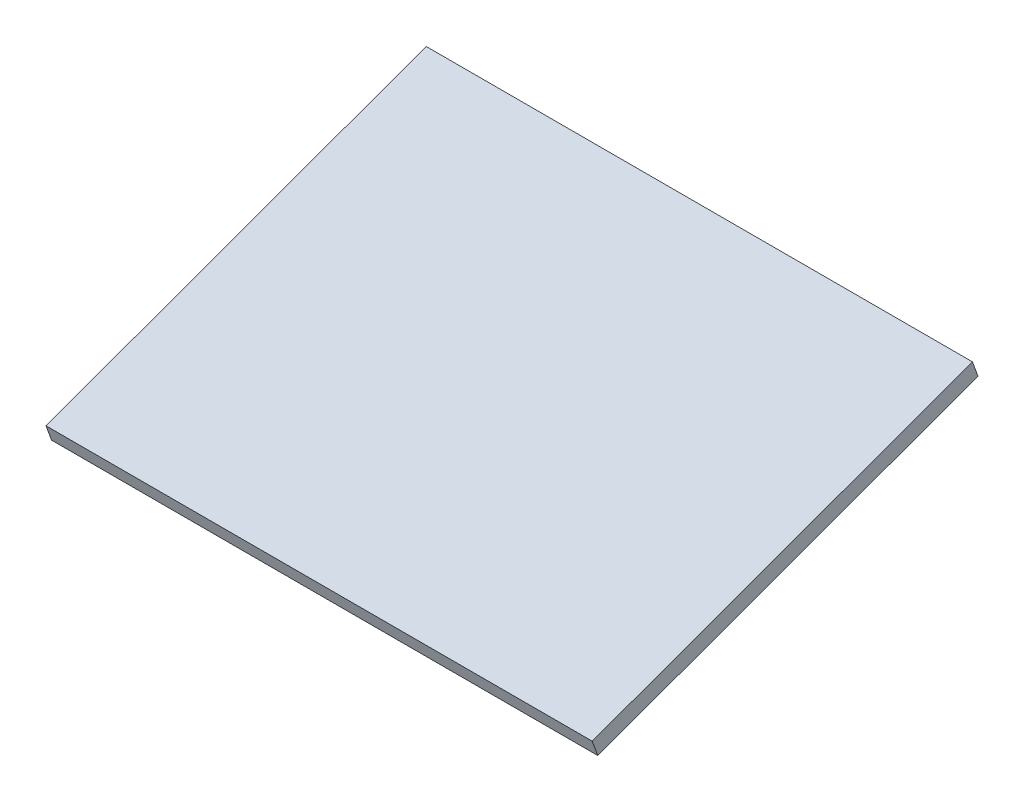
ISO-10303-21;
HEADER;
FILE_DESCRIPTION(('STEP AP214'),'2;1');
FILE_NAME('part.step','',(''),(''),'','','');
FILE_SCHEMA(('AUTOMOTIVE_DESIGN { 1 0 10303 214 1 1 1 1 }'));
ENDSEC;
DATA;
#1=APPLICATION_CONTEXT('core data for automotive mechanical design processes');
#2=APPLICATION_PROTOCOL_DEFINITION('international standard','automotive_design',2000,#1);
#3=PRODUCT_CONTEXT('',#1,'mechanical');
#4=PRODUCT('Part','Part','',(#3));
#5=PRODUCT_RELATED_PRODUCT_CATEGORY('part','',(#4));
#6=PRODUCT_DEFINITION_FORMATION('','',#4);
#7=PRODUCT_DEFINITION_CONTEXT('part definition',#1,'design');
#8=PRODUCT_DEFINITION('design','',#6,#7);
#9=PRODUCT_DEFINITION_SHAPE('','',#8);
#10=(LENGTH_UNIT() NAMED_UNIT(*) SI_UNIT(.MILLI.,.METRE.));
#11=(NAMED_UNIT(*) PLANE_ANGLE_UNIT() SI_UNIT($,.RADIAN.));
#12=(NAMED_UNIT(*) SI_UNIT($,.STERADIAN.) SOLID_ANGLE_UNIT());
#13=UNCERTAINTY_MEASURE_WITH_UNIT(LENGTH_MEASURE(1.E-05),#10,'distance_accuracy_value','');
#14=(GEOMETRIC_REPRESENTATION_CONTEXT(3) GLOBAL_UNCERTAINTY_ASSIGNED_CONTEXT((#13)) GLOBAL_UNIT_ASSIGNED_CONTEXT((#10,
#11,#12)) REPRESENTATION_CONTEXT('',''));
#15=CARTESIAN_POINT('',(0.,0.,0.));
#16=DIRECTION('',(0.,0.,1.));
#17=DIRECTION('',(1.,0.,0.));
#18=AXIS2_PLACEMENT_3D('',#15,#16,#17);
#19=CARTESIAN_POINT('',(27.,234.2934,-9.7543));
#20=DIRECTION('',(0.,-0.342004001871024,0.939698495637939));
#21=DIRECTION('',(0.,-0.939698495637939,-0.342004001871024));
#22=AXIS2_PLACEMENT_3D('',#19,#20,#21);
#23=PLANE('',#22);
#24=DIRECTION('',(0.,0.939698495637939,0.342004001871024));
#25=VECTOR('',#24,1.);
#26=CARTESIAN_POINT('',(-27.,234.2934,-9.7543));
#27=LINE('',#26,#25);
#28=CARTESIAN_POINT('',(-27.,232.7899,-10.3015));
#29=VERTEX_POINT('',#28);
#30=CARTESIAN_POINT('',(-27.,234.2934,-9.7543));
#31=VERTEX_POINT('',#30);
#32=EDGE_CURVE('E102',#29,#31,#27,.T.);
#33=ORIENTED_EDGE('',*,*,#32,.T.);
#34=DIRECTION('',(-1.,0.,0.));
#35=VECTOR('',#34,1.);
#36=CARTESIAN_POINT('',(27.,234.2934,-9.7543));
#37=LINE('',#36,#35);
#38=CARTESIAN_POINT('',(27.,234.2934,-9.7543));
#39=VERTEX_POINT('',#38);
#40=EDGE_CURVE('E11',#39,#31,#37,.T.);
#41=ORIENTED_EDGE('',*,*,#40,.F.);
#42=DIRECTION('',(0.,0.939698495637939,0.342004001871024));
#43=VECTOR('',#42,1.);
#44=CARTESIAN_POINT('',(27.,234.2934,-9.7543));
#45=LINE('',#44,#43);
#46=CARTESIAN_POINT('',(27.,232.7899,-10.3015));
#47=VERTEX_POINT('',#46);
#48=EDGE_CURVE('E90',#47,#39,#45,.T.);
#49=ORIENTED_EDGE('',*,*,#48,.F.);
#50=DIRECTION('',(-1.,0.,0.));
#51=VECTOR('',#50,1.);
#52=CARTESIAN_POINT('',(27.,232.7899,-10.3015));
#53=LINE('',#52,#51);
#54=EDGE_CURVE('E98',#47,#29,#53,.T.);
#55=ORIENTED_EDGE('',*,*,#54,.T.);
#56=EDGE_LOOP('',(#33,#41,#49,#55));
#57=FACE_BOUND('',#56,.T.);
#58=ADVANCED_FACE('F39',(#57),#23,.F.);
#59=CARTESIAN_POINT('',(27.,220.6126,27.8334));
#60=DIRECTION('',(0.,-0.939692652720624,-0.342020055585745));
#61=DIRECTION('',(0.,0.342020055585745,-0.939692652720624));
#62=AXIS2_PLACEMENT_3D('',#59,#60,#61);
#63=PLANE('',#62);
#64=DIRECTION('',(0.,-0.342020055585745,0.939692652720624));
#65=VECTOR('',#64,1.);
#66=CARTESIAN_POINT('',(-27.,220.6126,27.8334));
#67=LINE('',#66,#65);
#68=CARTESIAN_POINT('',(-27.,220.6126,27.8334));
#69=VERTEX_POINT('',#68);
#70=EDGE_CURVE('E94',#31,#69,#67,.T.);
#71=ORIENTED_EDGE('',*,*,#70,.T.);
#72=DIRECTION('',(-1.,0.,0.));
#73=VECTOR('',#72,1.);
#74=CARTESIAN_POINT('',(27.,220.6126,27.8334));
#75=LINE('',#74,#73);
#76=CARTESIAN_POINT('',(27.,220.6126,27.8334));
#77=VERTEX_POINT('',#76);
#78=EDGE_CURVE('E47',#77,#69,#75,.T.);
#79=ORIENTED_EDGE('',*,*,#78,.F.);
#80=DIRECTION('',(0.,-0.342020055585745,0.939692652720624));
#81=VECTOR('',#80,1.);
#82=CARTESIAN_POINT('',(27.,220.6126,27.8334));
#83=LINE('',#82,#81);
#84=EDGE_CURVE('E85',#39,#77,#83,.T.);
#85=ORIENTED_EDGE('',*,*,#84,.F.);
#86=ORIENTED_EDGE('',*,*,#40,.T.);
#87=EDGE_LOOP('',(#71,#79,#85,#86));
#88=FACE_BOUND('',#87,.T.);
#89=ADVANCED_FACE('F93',(#88),#63,.F.);
#90=CARTESIAN_POINT('',(27.,219.1091,27.2862));
#91=DIRECTION('',(0.,0.342004001871029,-0.939698495637937));
#92=DIRECTION('',(0.,0.939698495637937,0.342004001871029));
#93=AXIS2_PLACEMENT_3D('',#90,#91,#92);
#94=PLANE('',#93);
#95=DIRECTION('',(0.,-0.939698495637936,-0.342004001871029));
#96=VECTOR('',#95,1.);
#97=CARTESIAN_POINT('',(-27.,219.1091,27.2862));
#98=LINE('',#97,#96);
#99=CARTESIAN_POINT('',(-27.,219.1091,27.2862));
#100=VERTEX_POINT('',#99);
#101=EDGE_CURVE('E72',#69,#100,#98,.T.);
#102=ORIENTED_EDGE('',*,*,#101,.T.);
#103=DIRECTION('',(-1.,0.,0.));
#104=VECTOR('',#103,1.);
#105=CARTESIAN_POINT('',(27.,219.1091,27.2862));
#106=LINE('',#105,#104);
#107=CARTESIAN_POINT('',(27.,219.1091,27.2862));
#108=VERTEX_POINT('',#107);
#109=EDGE_CURVE('E95',#108,#100,#106,.T.);
#110=ORIENTED_EDGE('',*,*,#109,.F.);
#111=DIRECTION('',(0.,-0.939698495637936,-0.342004001871029));
#112=VECTOR('',#111,1.);
#113=CARTESIAN_POINT('',(27.,219.1091,27.2862));
#114=LINE('',#113,#112);
#115=EDGE_CURVE('E88',#77,#108,#114,.T.);
#116=ORIENTED_EDGE('',*,*,#115,.F.);
#117=ORIENTED_EDGE('',*,*,#78,.T.);
#118=EDGE_LOOP('',(#102,#110,#116,#117));
#119=FACE_BOUND('',#118,.T.);
#120=ADVANCED_FACE('F96',(#119),#94,.F.);
#121=CARTESIAN_POINT('',(27.,232.7899,-10.3015));
#122=DIRECTION('',(0.,0.939692652720625,0.342020055585744));
#123=DIRECTION('',(0.,-0.342020055585744,0.939692652720625));
#124=AXIS2_PLACEMENT_3D('',#121,#122,#123);
#125=PLANE('',#124);
#126=DIRECTION('',(0.,0.342020055585744,-0.939692652720625));
#127=VECTOR('',#126,1.);
#128=CARTESIAN_POINT('',(-27.,232.7899,-10.3015));
#129=LINE('',#128,#127);
#130=EDGE_CURVE('E78',#100,#29,#129,.T.);
#131=ORIENTED_EDGE('',*,*,#130,.T.);
#132=ORIENTED_EDGE('',*,*,#54,.F.);
#133=DIRECTION('',(0.,0.342020055585744,-0.939692652720625));
#134=VECTOR('',#133,1.);
#135=CARTESIAN_POINT('',(27.,232.7899,-10.3015));
#136=LINE('',#135,#134);
#137=EDGE_CURVE('E55',#108,#47,#136,.T.);
#138=ORIENTED_EDGE('',*,*,#137,.F.);
#139=ORIENTED_EDGE('',*,*,#109,.T.);
#140=EDGE_LOOP('',(#131,#132,#138,#139));
#141=FACE_BOUND('',#140,.T.);
#142=ADVANCED_FACE('F109',(#141),#125,.F.);
#143=CARTESIAN_POINT('',(27.,0.,0.));
#144=DIRECTION('',(-1.,0.,0.));
#145=DIRECTION('',(0.,0.,1.));
#146=AXIS2_PLACEMENT_3D('',#143,#144,#145);
#147=PLANE('',#146);
#148=ORIENTED_EDGE('',*,*,#48,.T.);
#149=ORIENTED_EDGE('',*,*,#84,.T.);
#150=ORIENTED_EDGE('',*,*,#115,.T.);
#151=ORIENTED_EDGE('',*,*,#137,.T.);
#152=EDGE_LOOP('',(#148,#149,#150,#151));
#153=FACE_BOUND('',#152,.T.);
#154=ADVANCED_FACE('F86',(#153),#147,.F.);
#155=CARTESIAN_POINT('',(-27.,0.,0.));
#156=DIRECTION('',(-1.,0.,0.));
#157=DIRECTION('',(0.,0.,1.));
#158=AXIS2_PLACEMENT_3D('',#155,#156,#157);
#159=PLANE('',#158);
#160=ORIENTED_EDGE('',*,*,#32,.F.);
#161=ORIENTED_EDGE('',*,*,#130,.F.);
#162=ORIENTED_EDGE('',*,*,#101,.F.);
#163=ORIENTED_EDGE('',*,*,#70,.F.);
#164=EDGE_LOOP('',(#160,#161,#162,#163));
#165=FACE_BOUND('',#164,.T.);
#166=ADVANCED_FACE('F112',(#165),#159,.T.);
#167=CLOSED_SHELL('',(#58,#89,#120,#142,#154,#166));
#168=MANIFOLD_SOLID_BREP('B2',#167);
#169=ADVANCED_BREP_SHAPE_REPRESENTATION('',(#18,#168),#14);
#170=SHAPE_DEFINITION_REPRESENTATION(#9,#169);
ENDSEC;
END-ISO-10303-21;
